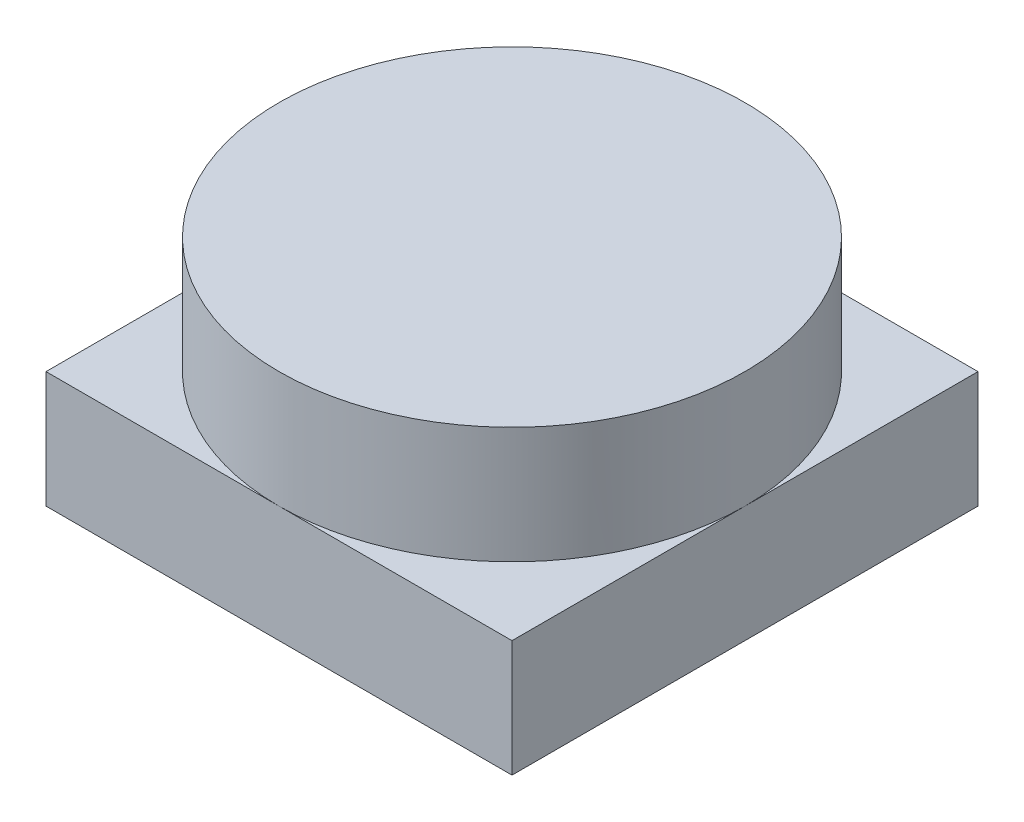
ISO-10303-21;
HEADER;
FILE_DESCRIPTION(('STEP AP214'),'2;1');
FILE_NAME('part.step','',(''),(''),'','','');
FILE_SCHEMA(('AUTOMOTIVE_DESIGN { 1 0 10303 214 1 1 1 1 }'));
ENDSEC;
DATA;
#1=APPLICATION_CONTEXT('core data for automotive mechanical design processes');
#2=APPLICATION_PROTOCOL_DEFINITION('international standard','automotive_design',2000,#1);
#3=PRODUCT_CONTEXT('',#1,'mechanical');
#4=PRODUCT('Part','Part','',(#3));
#5=PRODUCT_RELATED_PRODUCT_CATEGORY('part','',(#4));
#6=PRODUCT_DEFINITION_FORMATION('','',#4);
#7=PRODUCT_DEFINITION_CONTEXT('part definition',#1,'design');
#8=PRODUCT_DEFINITION('design','',#6,#7);
#9=PRODUCT_DEFINITION_SHAPE('','',#8);
#10=(LENGTH_UNIT() NAMED_UNIT(*) SI_UNIT(.MILLI.,.METRE.));
#11=(NAMED_UNIT(*) PLANE_ANGLE_UNIT() SI_UNIT($,.RADIAN.));
#12=(NAMED_UNIT(*) SI_UNIT($,.STERADIAN.) SOLID_ANGLE_UNIT());
#13=UNCERTAINTY_MEASURE_WITH_UNIT(LENGTH_MEASURE(1.E-05),#10,'distance_accuracy_value','');
#14=(GEOMETRIC_REPRESENTATION_CONTEXT(3) GLOBAL_UNCERTAINTY_ASSIGNED_CONTEXT((#13)) GLOBAL_UNIT_ASSIGNED_CONTEXT((#10,
#11,#12)) REPRESENTATION_CONTEXT('',''));
#15=CARTESIAN_POINT('',(0.,0.,0.));
#16=DIRECTION('',(0.,0.,1.));
#17=DIRECTION('',(1.,0.,0.));
#18=AXIS2_PLACEMENT_3D('',#15,#16,#17);
#19=CARTESIAN_POINT('',(0.,10.,0.));
#20=DIRECTION('',(0.,-1.,0.));
#21=DIRECTION('',(0.,0.,-1.));
#22=AXIS2_PLACEMENT_3D('',#19,#20,#21);
#23=CYLINDRICAL_SURFACE('',#22,10.);
#24=CARTESIAN_POINT('',(0.,10.,0.));
#25=DIRECTION('',(0.,1.,0.));
#26=DIRECTION('',(0.,0.,1.));
#27=AXIS2_PLACEMENT_3D('',#24,#25,#26);
#28=CIRCLE('',#27,10.);
#29=CARTESIAN_POINT('',(0.,10.,10.));
#30=VERTEX_POINT('',#29);
#31=EDGE_CURVE('E107',#30,#30,#28,.T.);
#32=ORIENTED_EDGE('',*,*,#31,.F.);
#33=EDGE_LOOP('',(#32));
#34=FACE_BOUND('',#33,.T.);
#35=CARTESIAN_POINT('',(0.,5.,0.));
#36=DIRECTION('',(0.,-1.,0.));
#37=DIRECTION('',(0.,0.,-1.));
#38=AXIS2_PLACEMENT_3D('',#35,#36,#37);
#39=CIRCLE('',#38,10.);
#40=CARTESIAN_POINT('',(0.,5.,-10.));
#41=VERTEX_POINT('',#40);
#42=CARTESIAN_POINT('',(9.99999999999999,5.,0.));
#43=VERTEX_POINT('',#42);
#44=EDGE_CURVE('E11',#41,#43,#39,.T.);
#45=ORIENTED_EDGE('',*,*,#44,.F.);
#46=CARTESIAN_POINT('',(-10.,5.,0.));
#47=VERTEX_POINT('',#46);
#48=EDGE_CURVE('E36',#47,#41,#39,.T.);
#49=ORIENTED_EDGE('',*,*,#48,.F.);
#50=CARTESIAN_POINT('',(0.,5.,10.));
#51=VERTEX_POINT('',#50);
#52=EDGE_CURVE('E51',#51,#47,#39,.T.);
#53=ORIENTED_EDGE('',*,*,#52,.F.);
#54=EDGE_CURVE('E41',#43,#51,#39,.T.);
#55=ORIENTED_EDGE('',*,*,#54,.F.);
#56=EDGE_LOOP('',(#45,#49,#53,#55));
#57=FACE_BOUND('',#56,.T.);
#58=ADVANCED_FACE('F33',(#34,#57),#23,.T.);
#59=CARTESIAN_POINT('',(0.,10.,0.));
#60=DIRECTION('',(0.,1.,0.));
#61=DIRECTION('',(0.,0.,1.));
#62=AXIS2_PLACEMENT_3D('',#59,#60,#61);
#63=PLANE('',#62);
#64=ORIENTED_EDGE('',*,*,#31,.T.);
#65=EDGE_LOOP('',(#64));
#66=FACE_BOUND('',#65,.T.);
#67=ADVANCED_FACE('F159',(#66),#63,.T.);
#68=CARTESIAN_POINT('',(0.,5.,0.));
#69=DIRECTION('',(0.,-1.,0.));
#70=DIRECTION('',(0.,0.,-1.));
#71=AXIS2_PLACEMENT_3D('',#68,#69,#70);
#72=PLANE('',#71);
#73=DIRECTION('',(-1.,0.,0.));
#74=VECTOR('',#73,1.);
#75=CARTESIAN_POINT('',(-10.,5.,-10.));
#76=LINE('',#75,#74);
#77=CARTESIAN_POINT('',(9.99999999999999,5.,-10.));
#78=VERTEX_POINT('',#77);
#79=EDGE_CURVE('E85',#78,#41,#76,.T.);
#80=ORIENTED_EDGE('',*,*,#79,.T.);
#81=ORIENTED_EDGE('',*,*,#44,.T.);
#82=DIRECTION('',(0.,0.,-1.));
#83=VECTOR('',#82,1.);
#84=CARTESIAN_POINT('',(9.99999999999999,5.,10.));
#85=LINE('',#84,#83);
#86=EDGE_CURVE('E82',#43,#78,#85,.T.);
#87=ORIENTED_EDGE('',*,*,#86,.T.);
#88=EDGE_LOOP('',(#80,#81,#87));
#89=FACE_BOUND('',#88,.T.);
#90=ADVANCED_FACE('F84',(#89),#72,.F.);
#91=CARTESIAN_POINT('',(9.99999999999999,5.,10.));
#92=VERTEX_POINT('',#91);
#93=EDGE_CURVE('E90',#92,#43,#85,.T.);
#94=ORIENTED_EDGE('',*,*,#93,.T.);
#95=ORIENTED_EDGE('',*,*,#54,.T.);
#96=DIRECTION('',(1.,0.,0.));
#97=VECTOR('',#96,1.);
#98=CARTESIAN_POINT('',(-10.,5.,10.));
#99=LINE('',#98,#97);
#100=EDGE_CURVE('E130',#51,#92,#99,.T.);
#101=ORIENTED_EDGE('',*,*,#100,.T.);
#102=EDGE_LOOP('',(#94,#95,#101));
#103=FACE_BOUND('',#102,.T.);
#104=ADVANCED_FACE('F146',(#103),#72,.F.);
#105=CARTESIAN_POINT('',(-10.,5.,10.));
#106=VERTEX_POINT('',#105);
#107=EDGE_CURVE('E119',#106,#51,#99,.T.);
#108=ORIENTED_EDGE('',*,*,#107,.T.);
#109=ORIENTED_EDGE('',*,*,#52,.T.);
#110=DIRECTION('',(0.,0.,1.));
#111=VECTOR('',#110,1.);
#112=CARTESIAN_POINT('',(-10.,5.,10.));
#113=LINE('',#112,#111);
#114=EDGE_CURVE('E101',#47,#106,#113,.T.);
#115=ORIENTED_EDGE('',*,*,#114,.T.);
#116=EDGE_LOOP('',(#108,#109,#115));
#117=FACE_BOUND('',#116,.T.);
#118=ADVANCED_FACE('F144',(#117),#72,.F.);
#119=CARTESIAN_POINT('',(9.99999999999999,5.,10.));
#120=DIRECTION('',(-1.,0.,0.));
#121=DIRECTION('',(0.,0.,1.));
#122=AXIS2_PLACEMENT_3D('',#119,#120,#121);
#123=PLANE('',#122);
#124=ORIENTED_EDGE('',*,*,#86,.F.);
#125=ORIENTED_EDGE('',*,*,#93,.F.);
#126=DIRECTION('',(0.,-1.,0.));
#127=VECTOR('',#126,1.);
#128=CARTESIAN_POINT('',(9.99999999999999,5.,10.));
#129=LINE('',#128,#127);
#130=CARTESIAN_POINT('',(9.99999999999999,0.,10.));
#131=VERTEX_POINT('',#130);
#132=EDGE_CURVE('E117',#92,#131,#129,.T.);
#133=ORIENTED_EDGE('',*,*,#132,.T.);
#134=DIRECTION('',(0.,0.,-1.));
#135=VECTOR('',#134,1.);
#136=CARTESIAN_POINT('',(9.99999999999999,0.,10.));
#137=LINE('',#136,#135);
#138=CARTESIAN_POINT('',(9.99999999999999,0.,-10.));
#139=VERTEX_POINT('',#138);
#140=EDGE_CURVE('E106',#131,#139,#137,.T.);
#141=ORIENTED_EDGE('',*,*,#140,.T.);
#142=DIRECTION('',(0.,-1.,0.));
#143=VECTOR('',#142,1.);
#144=CARTESIAN_POINT('',(9.99999999999999,5.,-10.));
#145=LINE('',#144,#143);
#146=EDGE_CURVE('E98',#78,#139,#145,.T.);
#147=ORIENTED_EDGE('',*,*,#146,.F.);
#148=EDGE_LOOP('',(#124,#125,#133,#141,#147));
#149=FACE_BOUND('',#148,.T.);
#150=ADVANCED_FACE('F104',(#149),#123,.F.);
#151=CARTESIAN_POINT('',(-10.,5.,-10.));
#152=DIRECTION('',(0.,0.,1.));
#153=DIRECTION('',(1.,0.,0.));
#154=AXIS2_PLACEMENT_3D('',#151,#152,#153);
#155=PLANE('',#154);
#156=CARTESIAN_POINT('',(-10.,5.,-10.));
#157=VERTEX_POINT('',#156);
#158=EDGE_CURVE('E100',#41,#157,#76,.T.);
#159=ORIENTED_EDGE('',*,*,#158,.F.);
#160=ORIENTED_EDGE('',*,*,#79,.F.);
#161=ORIENTED_EDGE('',*,*,#146,.T.);
#162=DIRECTION('',(-1.,0.,0.));
#163=VECTOR('',#162,1.);
#164=CARTESIAN_POINT('',(-10.,0.,-10.));
#165=LINE('',#164,#163);
#166=CARTESIAN_POINT('',(-10.,0.,-10.));
#167=VERTEX_POINT('',#166);
#168=EDGE_CURVE('E125',#139,#167,#165,.T.);
#169=ORIENTED_EDGE('',*,*,#168,.T.);
#170=DIRECTION('',(0.,-1.,0.));
#171=VECTOR('',#170,1.);
#172=CARTESIAN_POINT('',(-10.,5.,-10.));
#173=LINE('',#172,#171);
#174=EDGE_CURVE('E108',#157,#167,#173,.T.);
#175=ORIENTED_EDGE('',*,*,#174,.F.);
#176=EDGE_LOOP('',(#159,#160,#161,#169,#175));
#177=FACE_BOUND('',#176,.T.);
#178=ADVANCED_FACE('F96',(#177),#155,.F.);
#179=CARTESIAN_POINT('',(-10.,5.,10.));
#180=DIRECTION('',(1.,0.,0.));
#181=DIRECTION('',(0.,0.,-1.));
#182=AXIS2_PLACEMENT_3D('',#179,#180,#181);
#183=PLANE('',#182);
#184=ORIENTED_EDGE('',*,*,#114,.F.);
#185=EDGE_CURVE('E131',#157,#47,#113,.T.);
#186=ORIENTED_EDGE('',*,*,#185,.F.);
#187=ORIENTED_EDGE('',*,*,#174,.T.);
#188=DIRECTION('',(0.,0.,1.));
#189=VECTOR('',#188,1.);
#190=CARTESIAN_POINT('',(-10.,0.,10.));
#191=LINE('',#190,#189);
#192=CARTESIAN_POINT('',(-10.,0.,10.));
#193=VERTEX_POINT('',#192);
#194=EDGE_CURVE('E122',#167,#193,#191,.T.);
#195=ORIENTED_EDGE('',*,*,#194,.T.);
#196=DIRECTION('',(0.,-1.,0.));
#197=VECTOR('',#196,1.);
#198=CARTESIAN_POINT('',(-10.,5.,10.));
#199=LINE('',#198,#197);
#200=EDGE_CURVE('E112',#106,#193,#199,.T.);
#201=ORIENTED_EDGE('',*,*,#200,.F.);
#202=EDGE_LOOP('',(#184,#186,#187,#195,#201));
#203=FACE_BOUND('',#202,.T.);
#204=ADVANCED_FACE('F140',(#203),#183,.F.);
#205=CARTESIAN_POINT('',(-10.,5.,10.));
#206=DIRECTION('',(0.,0.,-1.));
#207=DIRECTION('',(-1.,0.,0.));
#208=AXIS2_PLACEMENT_3D('',#205,#206,#207);
#209=PLANE('',#208);
#210=ORIENTED_EDGE('',*,*,#100,.F.);
#211=ORIENTED_EDGE('',*,*,#107,.F.);
#212=ORIENTED_EDGE('',*,*,#200,.T.);
#213=DIRECTION('',(1.,0.,0.));
#214=VECTOR('',#213,1.);
#215=CARTESIAN_POINT('',(-10.,0.,10.));
#216=LINE('',#215,#214);
#217=EDGE_CURVE('E91',#193,#131,#216,.T.);
#218=ORIENTED_EDGE('',*,*,#217,.T.);
#219=ORIENTED_EDGE('',*,*,#132,.F.);
#220=EDGE_LOOP('',(#210,#211,#212,#218,#219));
#221=FACE_BOUND('',#220,.T.);
#222=ADVANCED_FACE('F149',(#221),#209,.F.);
#223=ORIENTED_EDGE('',*,*,#185,.T.);
#224=ORIENTED_EDGE('',*,*,#48,.T.);
#225=ORIENTED_EDGE('',*,*,#158,.T.);
#226=EDGE_LOOP('',(#223,#224,#225));
#227=FACE_BOUND('',#226,.T.);
#228=ADVANCED_FACE('F136',(#227),#72,.F.);
#229=CARTESIAN_POINT('',(0.,0.,0.));
#230=DIRECTION('',(0.,1.,0.));
#231=DIRECTION('',(0.,0.,1.));
#232=AXIS2_PLACEMENT_3D('',#229,#230,#231);
#233=PLANE('',#232);
#234=ORIENTED_EDGE('',*,*,#168,.F.);
#235=ORIENTED_EDGE('',*,*,#140,.F.);
#236=ORIENTED_EDGE('',*,*,#217,.F.);
#237=ORIENTED_EDGE('',*,*,#194,.F.);
#238=EDGE_LOOP('',(#234,#235,#236,#237));
#239=FACE_BOUND('',#238,.T.);
#240=ADVANCED_FACE('F151',(#239),#233,.F.);
#241=CLOSED_SHELL('',(#58,#67,#90,#104,#118,#150,#178,#204,#222,#228,#240));
#242=MANIFOLD_SOLID_BREP('B2',#241);
#243=ADVANCED_BREP_SHAPE_REPRESENTATION('',(#18,#242),#14);
#244=SHAPE_DEFINITION_REPRESENTATION(#9,#243);
ENDSEC;
END-ISO-10303-21;
